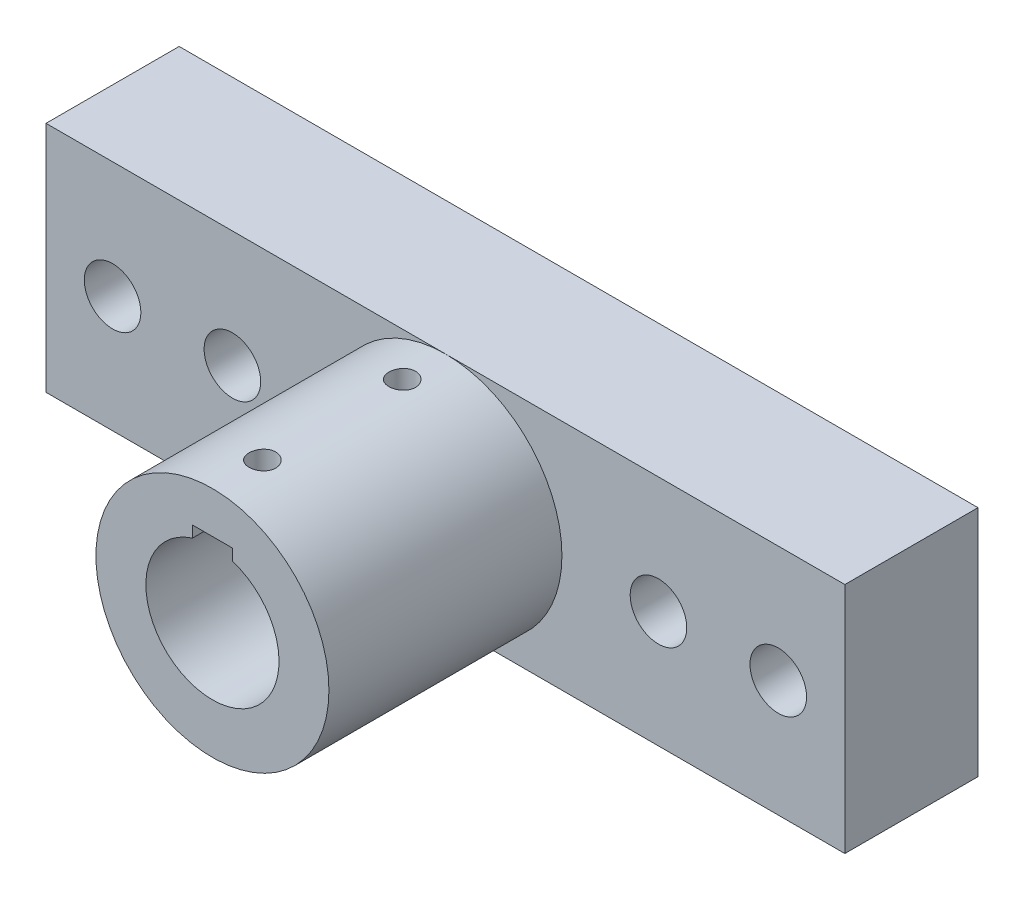
ISO-10303-21;
HEADER;
FILE_DESCRIPTION(('STEP AP214'),'2;1');
FILE_NAME('part.step','',(''),(''),'','','');
FILE_SCHEMA(('AUTOMOTIVE_DESIGN { 1 0 10303 214 1 1 1 1 }'));
ENDSEC;
DATA;
#1=APPLICATION_CONTEXT('core data for automotive mechanical design processes');
#2=APPLICATION_PROTOCOL_DEFINITION('international standard','automotive_design',2000,#1);
#3=PRODUCT_CONTEXT('',#1,'mechanical');
#4=PRODUCT('Part','Part','',(#3));
#5=PRODUCT_RELATED_PRODUCT_CATEGORY('part','',(#4));
#6=PRODUCT_DEFINITION_FORMATION('','',#4);
#7=PRODUCT_DEFINITION_CONTEXT('part definition',#1,'design');
#8=PRODUCT_DEFINITION('design','',#6,#7);
#9=PRODUCT_DEFINITION_SHAPE('','',#8);
#10=(LENGTH_UNIT() NAMED_UNIT(*) SI_UNIT(.MILLI.,.METRE.));
#11=(NAMED_UNIT(*) PLANE_ANGLE_UNIT() SI_UNIT($,.RADIAN.));
#12=(NAMED_UNIT(*) SI_UNIT($,.STERADIAN.) SOLID_ANGLE_UNIT());
#13=UNCERTAINTY_MEASURE_WITH_UNIT(LENGTH_MEASURE(1.E-05),#10,'distance_accuracy_value','');
#14=(GEOMETRIC_REPRESENTATION_CONTEXT(3) GLOBAL_UNCERTAINTY_ASSIGNED_CONTEXT((#13)) GLOBAL_UNIT_ASSIGNED_CONTEXT((#10,
#11,#12)) REPRESENTATION_CONTEXT('',''));
#15=CARTESIAN_POINT('',(0.,0.,0.));
#16=DIRECTION('',(0.,0.,1.));
#17=DIRECTION('',(1.,0.,0.));
#18=AXIS2_PLACEMENT_3D('',#15,#16,#17);
#19=CARTESIAN_POINT('',(17.5,35.,40.));
#20=DIRECTION('',(0.,0.,-1.));
#21=DIRECTION('',(-1.,0.,0.));
#22=AXIS2_PLACEMENT_3D('',#19,#20,#21);
#23=PLANE('',#22);
#24=CARTESIAN_POINT('',(0.,17.5,40.));
#25=DIRECTION('',(0.,0.,1.));
#26=DIRECTION('',(1.,0.,0.));
#27=AXIS2_PLACEMENT_3D('',#24,#25,#26);
#28=CIRCLE('',#27,10.);
#29=CARTESIAN_POINT('',(-3.,27.0393920141695,40.));
#30=VERTEX_POINT('',#29);
#31=CARTESIAN_POINT('',(3.,27.0393920141695,40.));
#32=VERTEX_POINT('',#31);
#33=EDGE_CURVE('E250',#30,#32,#28,.T.);
#34=ORIENTED_EDGE('',*,*,#33,.F.);
#35=DIRECTION('',(0.,-1.,0.));
#36=VECTOR('',#35,1.);
#37=CARTESIAN_POINT('',(-3.,0.,40.));
#38=LINE('',#37,#36);
#39=CARTESIAN_POINT('',(-3.,28.75,40.));
#40=VERTEX_POINT('',#39);
#41=EDGE_CURVE('E98',#40,#30,#38,.T.);
#42=ORIENTED_EDGE('',*,*,#41,.F.);
#43=DIRECTION('',(1.,0.,0.));
#44=VECTOR('',#43,1.);
#45=CARTESIAN_POINT('',(0.,28.75,40.));
#46=LINE('',#45,#44);
#47=CARTESIAN_POINT('',(3.,28.75,40.));
#48=VERTEX_POINT('',#47);
#49=EDGE_CURVE('E237',#40,#48,#46,.T.);
#50=ORIENTED_EDGE('',*,*,#49,.T.);
#51=DIRECTION('',(0.,-1.,0.));
#52=VECTOR('',#51,1.);
#53=CARTESIAN_POINT('',(3.,0.,40.));
#54=LINE('',#53,#52);
#55=EDGE_CURVE('E253',#48,#32,#54,.T.);
#56=ORIENTED_EDGE('',*,*,#55,.T.);
#57=EDGE_LOOP('',(#34,#42,#50,#56));
#58=FACE_BOUND('',#57,.T.);
#59=CARTESIAN_POINT('',(0.,17.5,40.));
#60=DIRECTION('',(0.,0.,1.));
#61=DIRECTION('',(1.,0.,0.));
#62=AXIS2_PLACEMENT_3D('',#59,#60,#61);
#63=CIRCLE('',#62,17.5);
#64=CARTESIAN_POINT('',(17.5,17.5,40.));
#65=VERTEX_POINT('',#64);
#66=EDGE_CURVE('E175',#65,#65,#63,.T.);
#67=ORIENTED_EDGE('',*,*,#66,.T.);
#68=EDGE_LOOP('',(#67));
#69=FACE_BOUND('',#68,.T.);
#70=ADVANCED_FACE('F82',(#58,#69),#23,.F.);
#71=CARTESIAN_POINT('',(-60.,35.,5.00000000000001));
#72=DIRECTION('',(1.,0.,0.));
#73=DIRECTION('',(0.,0.,-1.));
#74=AXIS2_PLACEMENT_3D('',#71,#72,#73);
#75=PLANE('',#74);
#76=DIRECTION('',(0.,0.,1.));
#77=VECTOR('',#76,1.);
#78=CARTESIAN_POINT('',(-60.,0.,5.00000000000001));
#79=LINE('',#78,#77);
#80=CARTESIAN_POINT('',(-60.,0.,-15.));
#81=VERTEX_POINT('',#80);
#82=CARTESIAN_POINT('',(-60.,0.,5.00000000000001));
#83=VERTEX_POINT('',#82);
#84=EDGE_CURVE('E165',#81,#83,#79,.T.);
#85=ORIENTED_EDGE('',*,*,#84,.T.);
#86=DIRECTION('',(0.,-1.,0.));
#87=VECTOR('',#86,1.);
#88=CARTESIAN_POINT('',(-60.,35.,5.00000000000001));
#89=LINE('',#88,#87);
#90=CARTESIAN_POINT('',(-60.,35.,5.00000000000001));
#91=VERTEX_POINT('',#90);
#92=EDGE_CURVE('E12',#91,#83,#89,.T.);
#93=ORIENTED_EDGE('',*,*,#92,.F.);
#94=DIRECTION('',(0.,0.,1.));
#95=VECTOR('',#94,1.);
#96=CARTESIAN_POINT('',(-60.,35.,5.00000000000001));
#97=LINE('',#96,#95);
#98=CARTESIAN_POINT('',(-60.,35.,-15.));
#99=VERTEX_POINT('',#98);
#100=EDGE_CURVE('E270',#99,#91,#97,.T.);
#101=ORIENTED_EDGE('',*,*,#100,.F.);
#102=DIRECTION('',(0.,-1.,0.));
#103=VECTOR('',#102,1.);
#104=CARTESIAN_POINT('',(-60.,35.,-15.));
#105=LINE('',#104,#103);
#106=EDGE_CURVE('E286',#99,#81,#105,.T.);
#107=ORIENTED_EDGE('',*,*,#106,.T.);
#108=EDGE_LOOP('',(#85,#93,#101,#107));
#109=FACE_BOUND('',#108,.T.);
#110=ADVANCED_FACE('F84',(#109),#75,.F.);
#111=CARTESIAN_POINT('',(-17.5,35.,5.));
#112=DIRECTION('',(0.,0.,-1.));
#113=DIRECTION('',(-1.,0.,0.));
#114=AXIS2_PLACEMENT_3D('',#111,#112,#113);
#115=PLANE('',#114);
#116=CARTESIAN_POINT('',(-50.,17.5,5.));
#117=DIRECTION('',(0.,0.,1.));
#118=DIRECTION('',(1.,0.,0.));
#119=AXIS2_PLACEMENT_3D('',#116,#117,#118);
#120=CIRCLE('',#119,4.25);
#121=CARTESIAN_POINT('',(-45.75,17.5,5.));
#122=VERTEX_POINT('',#121);
#123=EDGE_CURVE('E205',#122,#122,#120,.T.);
#124=ORIENTED_EDGE('',*,*,#123,.F.);
#125=EDGE_LOOP('',(#124));
#126=FACE_BOUND('',#125,.T.);
#127=CARTESIAN_POINT('',(-32.,17.5,5.));
#128=DIRECTION('',(0.,0.,1.));
#129=DIRECTION('',(1.,0.,0.));
#130=AXIS2_PLACEMENT_3D('',#127,#128,#129);
#131=CIRCLE('',#130,4.25);
#132=CARTESIAN_POINT('',(-27.75,17.5,5.));
#133=VERTEX_POINT('',#132);
#134=EDGE_CURVE('E209',#133,#133,#131,.T.);
#135=ORIENTED_EDGE('',*,*,#134,.F.);
#136=EDGE_LOOP('',(#135));
#137=FACE_BOUND('',#136,.T.);
#138=DIRECTION('',(1.,0.,0.));
#139=VECTOR('',#138,1.);
#140=CARTESIAN_POINT('',(-17.5,0.,5.));
#141=LINE('',#140,#139);
#142=CARTESIAN_POINT('',(0.,0.,5.));
#143=VERTEX_POINT('',#142);
#144=EDGE_CURVE('E154',#83,#143,#141,.T.);
#145=ORIENTED_EDGE('',*,*,#144,.T.);
#146=CARTESIAN_POINT('',(0.,17.5,5.));
#147=DIRECTION('',(0.,0.,-1.));
#148=DIRECTION('',(-1.,0.,0.));
#149=AXIS2_PLACEMENT_3D('',#146,#147,#148);
#150=CIRCLE('',#149,17.5);
#151=CARTESIAN_POINT('',(0.,35.,5.));
#152=VERTEX_POINT('',#151);
#153=EDGE_CURVE('E157',#152,#143,#150,.F.);
#154=ORIENTED_EDGE('',*,*,#153,.F.);
#155=DIRECTION('',(1.,0.,0.));
#156=VECTOR('',#155,1.);
#157=CARTESIAN_POINT('',(-17.5,35.,5.));
#158=LINE('',#157,#156);
#159=EDGE_CURVE('E274',#91,#152,#158,.T.);
#160=ORIENTED_EDGE('',*,*,#159,.F.);
#161=ORIENTED_EDGE('',*,*,#92,.T.);
#162=EDGE_LOOP('',(#145,#154,#160,#161));
#163=FACE_BOUND('',#162,.T.);
#164=ADVANCED_FACE('F156',(#126,#137,#163),#115,.F.);
#165=CARTESIAN_POINT('',(60.,35.,5.00000000000001));
#166=DIRECTION('',(0.,0.,-1.));
#167=DIRECTION('',(-1.,0.,0.));
#168=AXIS2_PLACEMENT_3D('',#165,#166,#167);
#169=PLANE('',#168);
#170=CARTESIAN_POINT('',(32.,17.5,5.));
#171=DIRECTION('',(0.,0.,1.));
#172=DIRECTION('',(-1.,0.,0.));
#173=AXIS2_PLACEMENT_3D('',#170,#171,#172);
#174=CIRCLE('',#173,4.25);
#175=CARTESIAN_POINT('',(27.75,17.5,5.));
#176=VERTEX_POINT('',#175);
#177=EDGE_CURVE('E217',#176,#176,#174,.T.);
#178=ORIENTED_EDGE('',*,*,#177,.F.);
#179=EDGE_LOOP('',(#178));
#180=FACE_BOUND('',#179,.T.);
#181=CARTESIAN_POINT('',(50.,17.5,5.));
#182=DIRECTION('',(0.,0.,1.));
#183=DIRECTION('',(-1.,0.,0.));
#184=AXIS2_PLACEMENT_3D('',#181,#182,#183);
#185=CIRCLE('',#184,4.25);
#186=CARTESIAN_POINT('',(45.75,17.5,5.));
#187=VERTEX_POINT('',#186);
#188=EDGE_CURVE('E225',#187,#187,#185,.T.);
#189=ORIENTED_EDGE('',*,*,#188,.F.);
#190=EDGE_LOOP('',(#189));
#191=FACE_BOUND('',#190,.T.);
#192=DIRECTION('',(1.,0.,0.));
#193=VECTOR('',#192,1.);
#194=CARTESIAN_POINT('',(60.,0.,5.00000000000001));
#195=LINE('',#194,#193);
#196=CARTESIAN_POINT('',(60.,0.,5.00000000000001));
#197=VERTEX_POINT('',#196);
#198=EDGE_CURVE('E164',#143,#197,#195,.T.);
#199=ORIENTED_EDGE('',*,*,#198,.T.);
#200=DIRECTION('',(0.,-1.,0.));
#201=VECTOR('',#200,1.);
#202=CARTESIAN_POINT('',(60.,35.,5.00000000000001));
#203=LINE('',#202,#201);
#204=CARTESIAN_POINT('',(60.,35.,5.00000000000001));
#205=VERTEX_POINT('',#204);
#206=EDGE_CURVE('E91',#205,#197,#203,.T.);
#207=ORIENTED_EDGE('',*,*,#206,.F.);
#208=DIRECTION('',(1.,0.,0.));
#209=VECTOR('',#208,1.);
#210=CARTESIAN_POINT('',(60.,35.,5.00000000000001));
#211=LINE('',#210,#209);
#212=EDGE_CURVE('E187',#152,#205,#211,.T.);
#213=ORIENTED_EDGE('',*,*,#212,.F.);
#214=CARTESIAN_POINT('',(0.,17.5,5.));
#215=DIRECTION('',(0.,0.,-1.));
#216=DIRECTION('',(-1.,0.,0.));
#217=AXIS2_PLACEMENT_3D('',#214,#215,#216);
#218=CIRCLE('',#217,17.5);
#219=EDGE_CURVE('E171',#143,#152,#218,.F.);
#220=ORIENTED_EDGE('',*,*,#219,.F.);
#221=EDGE_LOOP('',(#199,#207,#213,#220));
#222=FACE_BOUND('',#221,.T.);
#223=ADVANCED_FACE('F186',(#180,#191,#222),#169,.F.);
#224=CARTESIAN_POINT('',(60.,35.,-15.));
#225=DIRECTION('',(-1.,0.,0.));
#226=DIRECTION('',(0.,0.,1.));
#227=AXIS2_PLACEMENT_3D('',#224,#225,#226);
#228=PLANE('',#227);
#229=DIRECTION('',(0.,0.,-1.));
#230=VECTOR('',#229,1.);
#231=CARTESIAN_POINT('',(60.,0.,-15.));
#232=LINE('',#231,#230);
#233=CARTESIAN_POINT('',(60.,0.,-15.));
#234=VERTEX_POINT('',#233);
#235=EDGE_CURVE('E180',#197,#234,#232,.T.);
#236=ORIENTED_EDGE('',*,*,#235,.T.);
#237=DIRECTION('',(0.,-1.,0.));
#238=VECTOR('',#237,1.);
#239=CARTESIAN_POINT('',(60.,35.,-15.));
#240=LINE('',#239,#238);
#241=CARTESIAN_POINT('',(60.,35.,-15.));
#242=VERTEX_POINT('',#241);
#243=EDGE_CURVE('E296',#242,#234,#240,.T.);
#244=ORIENTED_EDGE('',*,*,#243,.F.);
#245=DIRECTION('',(0.,0.,-1.));
#246=VECTOR('',#245,1.);
#247=CARTESIAN_POINT('',(60.,35.,-15.));
#248=LINE('',#247,#246);
#249=EDGE_CURVE('E280',#205,#242,#248,.T.);
#250=ORIENTED_EDGE('',*,*,#249,.F.);
#251=ORIENTED_EDGE('',*,*,#206,.T.);
#252=EDGE_LOOP('',(#236,#244,#250,#251));
#253=FACE_BOUND('',#252,.T.);
#254=ADVANCED_FACE('F303',(#253),#228,.F.);
#255=CARTESIAN_POINT('',(-60.,35.,-15.));
#256=DIRECTION('',(0.,0.,1.));
#257=DIRECTION('',(1.,0.,0.));
#258=AXIS2_PLACEMENT_3D('',#255,#256,#257);
#259=PLANE('',#258);
#260=CARTESIAN_POINT('',(-50.,17.5,-15.));
#261=DIRECTION('',(0.,0.,1.));
#262=DIRECTION('',(1.,0.,0.));
#263=AXIS2_PLACEMENT_3D('',#260,#261,#262);
#264=CIRCLE('',#263,4.25);
#265=CARTESIAN_POINT('',(-45.75,17.5,-15.));
#266=VERTEX_POINT('',#265);
#267=EDGE_CURVE('E201',#266,#266,#264,.T.);
#268=ORIENTED_EDGE('',*,*,#267,.T.);
#269=EDGE_LOOP('',(#268));
#270=FACE_BOUND('',#269,.T.);
#271=CARTESIAN_POINT('',(-32.,17.5,-15.));
#272=DIRECTION('',(0.,0.,1.));
#273=DIRECTION('',(1.,0.,0.));
#274=AXIS2_PLACEMENT_3D('',#271,#272,#273);
#275=CIRCLE('',#274,4.25);
#276=CARTESIAN_POINT('',(-27.75,17.5,-15.));
#277=VERTEX_POINT('',#276);
#278=EDGE_CURVE('E213',#277,#277,#275,.T.);
#279=ORIENTED_EDGE('',*,*,#278,.T.);
#280=EDGE_LOOP('',(#279));
#281=FACE_BOUND('',#280,.T.);
#282=CARTESIAN_POINT('',(32.,17.5,-15.));
#283=DIRECTION('',(0.,0.,1.));
#284=DIRECTION('',(-1.,0.,0.));
#285=AXIS2_PLACEMENT_3D('',#282,#283,#284);
#286=CIRCLE('',#285,4.25);
#287=CARTESIAN_POINT('',(27.75,17.5,-15.));
#288=VERTEX_POINT('',#287);
#289=EDGE_CURVE('E221',#288,#288,#286,.T.);
#290=ORIENTED_EDGE('',*,*,#289,.T.);
#291=EDGE_LOOP('',(#290));
#292=FACE_BOUND('',#291,.T.);
#293=CARTESIAN_POINT('',(50.,17.5,-15.));
#294=DIRECTION('',(0.,0.,1.));
#295=DIRECTION('',(-1.,0.,0.));
#296=AXIS2_PLACEMENT_3D('',#293,#294,#295);
#297=CIRCLE('',#296,4.25);
#298=CARTESIAN_POINT('',(45.75,17.5,-15.));
#299=VERTEX_POINT('',#298);
#300=EDGE_CURVE('E174',#299,#299,#297,.T.);
#301=ORIENTED_EDGE('',*,*,#300,.T.);
#302=EDGE_LOOP('',(#301));
#303=FACE_BOUND('',#302,.T.);
#304=DIRECTION('',(1.,0.,0.));
#305=VECTOR('',#304,1.);
#306=CARTESIAN_POINT('',(0.,28.75,-15.));
#307=LINE('',#306,#305);
#308=CARTESIAN_POINT('',(-3.,28.75,-15.));
#309=VERTEX_POINT('',#308);
#310=CARTESIAN_POINT('',(3.,28.75,-15.));
#311=VERTEX_POINT('',#310);
#312=EDGE_CURVE('E244',#309,#311,#307,.T.);
#313=ORIENTED_EDGE('',*,*,#312,.F.);
#314=DIRECTION('',(0.,-1.,0.));
#315=VECTOR('',#314,1.);
#316=CARTESIAN_POINT('',(-3.,0.,-15.));
#317=LINE('',#316,#315);
#318=CARTESIAN_POINT('',(-3.,27.0393920141695,-15.));
#319=VERTEX_POINT('',#318);
#320=EDGE_CURVE('E232',#309,#319,#317,.T.);
#321=ORIENTED_EDGE('',*,*,#320,.T.);
#322=CARTESIAN_POINT('',(0.,17.5,-15.));
#323=DIRECTION('',(0.,0.,1.));
#324=DIRECTION('',(1.,0.,0.));
#325=AXIS2_PLACEMENT_3D('',#322,#323,#324);
#326=CIRCLE('',#325,10.);
#327=CARTESIAN_POINT('',(3.,27.0393920141695,-15.));
#328=VERTEX_POINT('',#327);
#329=EDGE_CURVE('E236',#319,#328,#326,.T.);
#330=ORIENTED_EDGE('',*,*,#329,.T.);
#331=DIRECTION('',(0.,-1.,0.));
#332=VECTOR('',#331,1.);
#333=CARTESIAN_POINT('',(3.,0.,-15.));
#334=LINE('',#333,#332);
#335=EDGE_CURVE('E241',#311,#328,#334,.T.);
#336=ORIENTED_EDGE('',*,*,#335,.F.);
#337=EDGE_LOOP('',(#313,#321,#330,#336));
#338=FACE_BOUND('',#337,.T.);
#339=DIRECTION('',(-1.,0.,0.));
#340=VECTOR('',#339,1.);
#341=CARTESIAN_POINT('',(-60.,0.,-15.));
#342=LINE('',#341,#340);
#343=EDGE_CURVE('E275',#234,#81,#342,.T.);
#344=ORIENTED_EDGE('',*,*,#343,.T.);
#345=ORIENTED_EDGE('',*,*,#106,.F.);
#346=DIRECTION('',(-1.,0.,0.));
#347=VECTOR('',#346,1.);
#348=CARTESIAN_POINT('',(-60.,35.,-15.));
#349=LINE('',#348,#347);
#350=EDGE_CURVE('E283',#242,#99,#349,.T.);
#351=ORIENTED_EDGE('',*,*,#350,.F.);
#352=ORIENTED_EDGE('',*,*,#243,.T.);
#353=EDGE_LOOP('',(#344,#345,#351,#352));
#354=FACE_BOUND('',#353,.T.);
#355=ADVANCED_FACE('F312',(#270,#281,#292,#303,#338,#354),#259,.F.);
#356=CARTESIAN_POINT('',(0.,35.,0.));
#357=DIRECTION('',(0.,-1.,0.));
#358=DIRECTION('',(0.,0.,-1.));
#359=AXIS2_PLACEMENT_3D('',#356,#357,#358);
#360=PLANE('',#359);
#361=ORIENTED_EDGE('',*,*,#159,.T.);
#362=ORIENTED_EDGE('',*,*,#212,.T.);
#363=ORIENTED_EDGE('',*,*,#249,.T.);
#364=ORIENTED_EDGE('',*,*,#350,.T.);
#365=ORIENTED_EDGE('',*,*,#100,.T.);
#366=EDGE_LOOP('',(#361,#362,#363,#364,#365));
#367=FACE_BOUND('',#366,.T.);
#368=ADVANCED_FACE('F307',(#367),#360,.F.);
#369=CARTESIAN_POINT('',(0.,0.,0.));
#370=DIRECTION('',(0.,-1.,0.));
#371=DIRECTION('',(0.,0.,-1.));
#372=AXIS2_PLACEMENT_3D('',#369,#370,#371);
#373=PLANE('',#372);
#374=ORIENTED_EDGE('',*,*,#198,.F.);
#375=ORIENTED_EDGE('',*,*,#144,.F.);
#376=ORIENTED_EDGE('',*,*,#84,.F.);
#377=ORIENTED_EDGE('',*,*,#343,.F.);
#378=ORIENTED_EDGE('',*,*,#235,.F.);
#379=EDGE_LOOP('',(#374,#375,#376,#377,#378));
#380=FACE_BOUND('',#379,.T.);
#381=ADVANCED_FACE('F178',(#380),#373,.T.);
#382=CARTESIAN_POINT('',(-3.,0.,-15.));
#383=DIRECTION('',(-1.,0.,0.));
#384=DIRECTION('',(0.,0.,1.));
#385=AXIS2_PLACEMENT_3D('',#382,#383,#384);
#386=PLANE('',#385);
#387=ORIENTED_EDGE('',*,*,#41,.T.);
#388=DIRECTION('',(0.,0.,1.));
#389=VECTOR('',#388,1.);
#390=CARTESIAN_POINT('',(-3.,27.0393920141695,-15.));
#391=LINE('',#390,#389);
#392=EDGE_CURVE('E247',#319,#30,#391,.T.);
#393=ORIENTED_EDGE('',*,*,#392,.F.);
#394=ORIENTED_EDGE('',*,*,#320,.F.);
#395=DIRECTION('',(0.,0.,1.));
#396=VECTOR('',#395,1.);
#397=CARTESIAN_POINT('',(-3.,28.75,-15.));
#398=LINE('',#397,#396);
#399=EDGE_CURVE('E260',#309,#40,#398,.T.);
#400=ORIENTED_EDGE('',*,*,#399,.T.);
#401=EDGE_LOOP('',(#387,#393,#394,#400));
#402=FACE_BOUND('',#401,.T.);
#403=ADVANCED_FACE('F369',(#402),#386,.F.);
#404=CARTESIAN_POINT('',(0.,28.75,-15.));
#405=DIRECTION('',(0.,-1.,0.));
#406=DIRECTION('',(0.,0.,-1.));
#407=AXIS2_PLACEMENT_3D('',#404,#405,#406);
#408=PLANE('',#407);
#409=CARTESIAN_POINT('',(0.,28.75,32.5));
#410=DIRECTION('',(0.,-1.,0.));
#411=DIRECTION('',(0.,0.,-1.));
#412=AXIS2_PLACEMENT_3D('',#409,#410,#411);
#413=CIRCLE('',#412,2.);
#414=CARTESIAN_POINT('',(0.,28.75,30.5));
#415=VERTEX_POINT('',#414);
#416=EDGE_CURVE('E197',#415,#415,#413,.F.);
#417=ORIENTED_EDGE('',*,*,#416,.T.);
#418=EDGE_LOOP('',(#417));
#419=FACE_BOUND('',#418,.T.);
#420=CARTESIAN_POINT('',(0.,28.75,11.5));
#421=DIRECTION('',(0.,-1.,0.));
#422=DIRECTION('',(0.,0.,-1.));
#423=AXIS2_PLACEMENT_3D('',#420,#421,#422);
#424=CIRCLE('',#423,2.);
#425=CARTESIAN_POINT('',(0.,28.75,9.50000000000001));
#426=VERTEX_POINT('',#425);
#427=EDGE_CURVE('E583',#426,#426,#424,.F.);
#428=ORIENTED_EDGE('',*,*,#427,.T.);
#429=EDGE_LOOP('',(#428));
#430=FACE_BOUND('',#429,.T.);
#431=ORIENTED_EDGE('',*,*,#49,.F.);
#432=ORIENTED_EDGE('',*,*,#399,.F.);
#433=ORIENTED_EDGE('',*,*,#312,.T.);
#434=DIRECTION('',(0.,0.,1.));
#435=VECTOR('',#434,1.);
#436=CARTESIAN_POINT('',(3.,28.75,-15.));
#437=LINE('',#436,#435);
#438=EDGE_CURVE('E263',#311,#48,#437,.T.);
#439=ORIENTED_EDGE('',*,*,#438,.T.);
#440=EDGE_LOOP('',(#431,#432,#433,#439));
#441=FACE_BOUND('',#440,.T.);
#442=ADVANCED_FACE('F365',(#419,#430,#441),#408,.T.);
#443=CARTESIAN_POINT('',(3.,0.,-15.));
#444=DIRECTION('',(-1.,0.,0.));
#445=DIRECTION('',(0.,0.,1.));
#446=AXIS2_PLACEMENT_3D('',#443,#444,#445);
#447=PLANE('',#446);
#448=ORIENTED_EDGE('',*,*,#55,.F.);
#449=ORIENTED_EDGE('',*,*,#438,.F.);
#450=ORIENTED_EDGE('',*,*,#335,.T.);
#451=DIRECTION('',(0.,0.,1.));
#452=VECTOR('',#451,1.);
#453=CARTESIAN_POINT('',(3.,27.0393920141695,-15.));
#454=LINE('',#453,#452);
#455=EDGE_CURVE('E106',#328,#32,#454,.T.);
#456=ORIENTED_EDGE('',*,*,#455,.T.);
#457=EDGE_LOOP('',(#448,#449,#450,#456));
#458=FACE_BOUND('',#457,.T.);
#459=ADVANCED_FACE('F368',(#458),#447,.T.);
#460=CARTESIAN_POINT('',(0.,17.5,-15.));
#461=DIRECTION('',(0.,0.,1.));
#462=DIRECTION('',(1.,0.,0.));
#463=AXIS2_PLACEMENT_3D('',#460,#461,#462);
#464=CYLINDRICAL_SURFACE('',#463,10.);
#465=ORIENTED_EDGE('',*,*,#33,.T.);
#466=ORIENTED_EDGE('',*,*,#455,.F.);
#467=ORIENTED_EDGE('',*,*,#329,.F.);
#468=ORIENTED_EDGE('',*,*,#392,.T.);
#469=EDGE_LOOP('',(#465,#466,#467,#468));
#470=FACE_BOUND('',#469,.T.);
#471=ADVANCED_FACE('F363',(#470),#464,.F.);
#472=CARTESIAN_POINT('',(50.,17.5,-15.));
#473=DIRECTION('',(0.,0.,1.));
#474=DIRECTION('',(1.,0.,0.));
#475=AXIS2_PLACEMENT_3D('',#472,#473,#474);
#476=CYLINDRICAL_SURFACE('',#475,4.25);
#477=ORIENTED_EDGE('',*,*,#300,.F.);
#478=EDGE_LOOP('',(#477));
#479=FACE_BOUND('',#478,.T.);
#480=ORIENTED_EDGE('',*,*,#188,.T.);
#481=EDGE_LOOP('',(#480));
#482=FACE_BOUND('',#481,.T.);
#483=ADVANCED_FACE('F355',(#479,#482),#476,.F.);
#484=CARTESIAN_POINT('',(32.,17.5,-15.));
#485=DIRECTION('',(0.,0.,1.));
#486=DIRECTION('',(1.,0.,0.));
#487=AXIS2_PLACEMENT_3D('',#484,#485,#486);
#488=CYLINDRICAL_SURFACE('',#487,4.25);
#489=ORIENTED_EDGE('',*,*,#289,.F.);
#490=EDGE_LOOP('',(#489));
#491=FACE_BOUND('',#490,.T.);
#492=ORIENTED_EDGE('',*,*,#177,.T.);
#493=EDGE_LOOP('',(#492));
#494=FACE_BOUND('',#493,.T.);
#495=ADVANCED_FACE('F346',(#491,#494),#488,.F.);
#496=CARTESIAN_POINT('',(-32.,17.5,-15.));
#497=DIRECTION('',(0.,0.,1.));
#498=DIRECTION('',(1.,0.,0.));
#499=AXIS2_PLACEMENT_3D('',#496,#497,#498);
#500=CYLINDRICAL_SURFACE('',#499,4.25);
#501=ORIENTED_EDGE('',*,*,#278,.F.);
#502=EDGE_LOOP('',(#501));
#503=FACE_BOUND('',#502,.T.);
#504=ORIENTED_EDGE('',*,*,#134,.T.);
#505=EDGE_LOOP('',(#504));
#506=FACE_BOUND('',#505,.T.);
#507=ADVANCED_FACE('F343',(#503,#506),#500,.F.);
#508=CARTESIAN_POINT('',(-50.,17.5,-15.));
#509=DIRECTION('',(0.,0.,1.));
#510=DIRECTION('',(1.,0.,0.));
#511=AXIS2_PLACEMENT_3D('',#508,#509,#510);
#512=CYLINDRICAL_SURFACE('',#511,4.25);
#513=ORIENTED_EDGE('',*,*,#267,.F.);
#514=EDGE_LOOP('',(#513));
#515=FACE_BOUND('',#514,.T.);
#516=ORIENTED_EDGE('',*,*,#123,.T.);
#517=EDGE_LOOP('',(#516));
#518=FACE_BOUND('',#517,.T.);
#519=ADVANCED_FACE('F345',(#515,#518),#512,.F.);
#520=CARTESIAN_POINT('',(0.,17.5,-19.7487373415292));
#521=DIRECTION('',(0.,0.,1.));
#522=DIRECTION('',(1.,0.,0.));
#523=AXIS2_PLACEMENT_3D('',#520,#521,#522);
#524=CYLINDRICAL_SURFACE('',#523,17.5);
#525=CARTESIAN_POINT('',(0.,35.,34.5));
#526=CARTESIAN_POINT('',(-0.111949281131272,34.9999985510682,34.4999951997222));
#527=CARTESIAN_POINT('',(-0.223970370284169,34.9989143966958,34.4905688469133));
#528=CARTESIAN_POINT('',(-0.444900622583235,34.9946937577693,34.4531111143345));
#529=CARTESIAN_POINT('',(-0.553806324423905,34.9915550764498,34.4250598197261));
#530=CARTESIAN_POINT('',(-0.76527499571213,34.9835792974507,34.3511849395428));
#531=CARTESIAN_POINT('',(-0.867841986694448,34.9787432899077,34.3053727592277));
#532=CARTESIAN_POINT('',(-1.06381060236177,34.9679120331755,34.1973002592898));
#533=CARTESIAN_POINT('',(-1.15721390847254,34.9619169972561,34.1350429649174));
#534=CARTESIAN_POINT('',(-1.33265783514777,34.9494069384049,33.9955382762926));
#535=CARTESIAN_POINT('',(-1.41464987662083,34.9428898679339,33.9182299656205));
#536=CARTESIAN_POINT('',(-1.5645257957997,34.9300869526196,33.7509482436648));
#537=CARTESIAN_POINT('',(-1.63240898570475,34.9238011190613,33.6609742152912));
#538=CARTESIAN_POINT('',(-1.75231750467918,34.9121519566138,33.470604232541));
#539=CARTESIAN_POINT('',(-1.80429797266076,34.9067912557056,33.370179846836));
#540=CARTESIAN_POINT('',(-1.89063905410776,34.8976257108765,33.1619560375685));
#541=CARTESIAN_POINT('',(-1.9250002289204,34.8938208173886,33.0541568490897));
#542=CARTESIAN_POINT('',(-1.97498120601606,34.8882168566912,32.8347441867955));
#543=CARTESIAN_POINT('',(-1.99068245631194,34.8864090748178,32.7231494927737));
#544=CARTESIAN_POINT('',(-2.00314979639016,34.8849772070577,32.498895406583));
#545=CARTESIAN_POINT('',(-1.99991652712141,34.8853530472536,32.3862360505826));
#546=CARTESIAN_POINT('',(-1.9746735877826,34.8882379876878,32.1636154230489));
#547=CARTESIAN_POINT('',(-1.95275327430007,34.8907369355841,32.0536438692079));
#548=CARTESIAN_POINT('',(-1.89089772862114,34.8975706833084,31.8389506189016));
#549=CARTESIAN_POINT('',(-1.85096218648166,34.9019055147219,31.7342290127935));
#550=CARTESIAN_POINT('',(-1.7541125869063,34.9119342022004,31.5327285909367));
#551=CARTESIAN_POINT('',(-1.697159329054,34.9176311898807,31.4359687787687));
#552=CARTESIAN_POINT('',(-1.5679190891396,34.9297397716759,31.2533467072563));
#553=CARTESIAN_POINT('',(-1.49563152051157,34.9361513931222,31.1674848649804));
#554=CARTESIAN_POINT('',(-1.33727766100704,34.9490120091816,31.0085771083073));
#555=CARTESIAN_POINT('',(-1.25113428048549,34.955461005996,30.9356079930233));
#556=CARTESIAN_POINT('',(-1.06778054344645,34.9676349914203,30.8051537463782));
#557=CARTESIAN_POINT('',(-0.970570168013122,34.9733599787928,30.7476686414831));
#558=CARTESIAN_POINT('',(-0.767785399909198,34.9834436495983,30.6498155820125));
#559=CARTESIAN_POINT('',(-0.662208868897604,34.9878019823021,30.6094520204612));
#560=CARTESIAN_POINT('',(-0.445716005555921,34.9946579437091,30.5470466496761));
#561=CARTESIAN_POINT('',(-0.334799882177866,34.9971556451608,30.5250041241085));
#562=CARTESIAN_POINT('',(-0.11144084718914,34.9999995196358,30.4999651080582));
#563=CARTESIAN_POINT('',(0.000990049263887338,35.0003576527763,30.4968627405709));
#564=CARTESIAN_POINT('',(0.224770143214531,34.9989142301576,30.5095132992264));
#565=CARTESIAN_POINT('',(0.336119359859266,34.9971127126976,30.5252658909967));
#566=CARTESIAN_POINT('',(0.554265994438545,34.9915599395696,30.5750913035956));
#567=CARTESIAN_POINT('',(0.6610749957154,34.9878140135584,30.609114054366));
#568=CARTESIAN_POINT('',(0.867470606546543,34.9787921749894,30.6944622223766));
#569=CARTESIAN_POINT('',(0.967057008006428,34.9735162183709,30.7457881379076));
#570=CARTESIAN_POINT('',(1.1566560556988,34.9619935546906,30.8645447606647));
#571=CARTESIAN_POINT('',(1.24662524248109,34.9557427309721,30.9320444463113));
#572=CARTESIAN_POINT('',(1.41399482686995,34.9429836190554,31.0811343594058));
#573=CARTESIAN_POINT('',(1.49139480973755,34.9364753223705,31.1627250516236));
#574=CARTESIAN_POINT('',(1.63180089287334,34.9238982965486,31.3381453244017));
#575=CARTESIAN_POINT('',(1.69473712215656,34.9178317940395,31.4320310121307));
#576=CARTESIAN_POINT('',(1.80394755942105,34.9068606742743,31.6291019220503));
#577=CARTESIAN_POINT('',(1.85022205420213,34.9019560370195,31.7322869841319));
#578=CARTESIAN_POINT('',(1.92468057699606,34.8938786287494,31.9447957127648));
#579=CARTESIAN_POINT('',(1.9529049884149,34.8907019940762,32.0541050767896));
#580=CARTESIAN_POINT('',(1.99059267414119,34.8864287991637,32.2759500109253));
#581=CARTESIAN_POINT('',(2.00005666745658,34.885332159207,32.3884854572264));
#582=CARTESIAN_POINT('',(1.99994314687055,34.885345163739,32.6128933076389));
#583=CARTESIAN_POINT('',(1.99047539100516,34.8864420908835,32.7247657840231));
#584=CARTESIAN_POINT('',(1.95299850876729,34.8906913968281,32.9453189880881));
#585=CARTESIAN_POINT('',(1.92498937098975,34.8938437768924,33.0539997138055));
#586=CARTESIAN_POINT('',(1.85125733006852,34.9018450488478,33.2650760433623));
#587=CARTESIAN_POINT('',(1.80553879088569,34.9066935227579,33.3674731884096));
#588=CARTESIAN_POINT('',(1.69769666392679,34.9175414489812,33.5631591816063));
#589=CARTESIAN_POINT('',(1.63557300493567,34.9235409062907,33.6564479902137));
#590=CARTESIAN_POINT('',(1.496274276119,34.9360565183282,33.8318311336261));
#591=CARTESIAN_POINT('',(1.41901733601474,34.9425753637158,33.9138602539056));
#592=CARTESIAN_POINT('',(1.25181311513089,34.9553710614581,34.0638342739402));
#593=CARTESIAN_POINT('',(1.16186282631113,34.9616478560018,34.1317758258049));
#594=CARTESIAN_POINT('',(0.971500170550113,34.9732739611811,34.251826172331));
#595=CARTESIAN_POINT('',(0.871055194164787,34.9786202345149,34.3038835210676));
#596=CARTESIAN_POINT('',(0.662847939396797,34.9877513427388,34.3903202121152));
#597=CARTESIAN_POINT('',(0.55509389884871,34.9915379025678,34.4247190939397));
#598=CARTESIAN_POINT('',(0.372298085692644,34.9961924479184,34.4664711022651));
#599=CARTESIAN_POINT('',(0.298416630910322,34.9976134605341,34.4790267787562));
#600=CARTESIAN_POINT('',(0.149700818660185,34.999517718344,34.4957928085197));
#601=CARTESIAN_POINT('',(0.074866466722563,35.0000009689781,34.5000032102023));
#602=CARTESIAN_POINT('',(0.,35.,34.5));
#603=B_SPLINE_CURVE_WITH_KNOTS('',3,(#525,#526,#527,#528,#529,#530,#531,#532,#533,#534,#535,
#536,#537,#538,#539,#540,#541,#542,#543,#544,#545,#546,#547,#548,#549,#550,#551,#552,#553,#554,
#555,#556,#557,#558,#559,#560,#561,#562,#563,#564,#565,#566,#567,#568,#569,#570,#571,#572,#573,
#574,#575,#576,#577,#578,#579,#580,#581,#582,#583,#584,#585,#586,#587,#588,#589,#590,#591,#592,
#593,#594,#595,#596,#597,#598,#599,#600,#601,#602),.UNSPECIFIED.,.T.,.F.,(4,2,2,2,2,2,2,2,2,2,2,
2,2,2,2,2,2,2,2,2,2,2,2,2,2,2,2,2,2,2,2,2,2,2,2,2,2,2,4),(0.,0.335574416664281,
0.671508227518324,1.00722667281621,1.34288340216198,1.67992799894877,2.01698902267013,
2.35499229929769,2.69298480653802,3.02949654002249,3.36599688237658,3.70089713523239,
4.03580315010126,4.3714866496878,4.7071829921089,5.04481612297898,5.38244983094422,
5.72017011621976,6.05787719635448,6.39369472529333,6.7295062989598,7.06440223033913,
7.39930780676431,7.73566795085563,8.07203919137999,8.41000271890797,8.7479604287638,
9.08515935679787,9.42234536116485,9.75758217571839,10.0928191964809,10.4279736604432,
10.763129579344,11.1001514134581,11.4372532487619,11.7754355791757,12.1132428917892,
12.3376607387197,12.5620772838218),.UNSPECIFIED.);
#604=CARTESIAN_POINT('',(0.,35.,34.5));
#605=VERTEX_POINT('',#604);
#606=EDGE_CURVE('E189',#605,#605,#603,.T.);
#607=ORIENTED_EDGE('',*,*,#606,.T.);
#608=EDGE_LOOP('',(#607));
#609=FACE_BOUND('',#608,.T.);
#610=CARTESIAN_POINT('',(0.,35.,13.5));
#611=CARTESIAN_POINT('',(-0.111949281131272,34.9999985510682,13.4999951997222));
#612=CARTESIAN_POINT('',(-0.223970370284168,34.9989143966958,13.4905688469133));
#613=CARTESIAN_POINT('',(-0.444900622583235,34.9946937577693,13.4531111143345));
#614=CARTESIAN_POINT('',(-0.553806324423905,34.9915550764498,13.4250598197261));
#615=CARTESIAN_POINT('',(-0.76527499571213,34.9835792974507,13.3511849395428));
#616=CARTESIAN_POINT('',(-0.867841986694447,34.9787432899077,13.3053727592277));
#617=CARTESIAN_POINT('',(-1.06381060236177,34.9679120331755,13.1973002592898));
#618=CARTESIAN_POINT('',(-1.15721390847253,34.9619169972561,13.1350429649174));
#619=CARTESIAN_POINT('',(-1.33265783514777,34.9494069384049,12.9955382762926));
#620=CARTESIAN_POINT('',(-1.41464987662083,34.9428898679339,12.9182299656205));
#621=CARTESIAN_POINT('',(-1.5645257957997,34.9300869526196,12.7509482436648));
#622=CARTESIAN_POINT('',(-1.63240898570475,34.9238011190613,12.6609742152912));
#623=CARTESIAN_POINT('',(-1.75231750467918,34.9121519566138,12.470604232541));
#624=CARTESIAN_POINT('',(-1.80429797266076,34.9067912557056,12.370179846836));
#625=CARTESIAN_POINT('',(-1.89063905410776,34.8976257108765,12.1619560375685));
#626=CARTESIAN_POINT('',(-1.9250002289204,34.8938208173886,12.0541568490897));
#627=CARTESIAN_POINT('',(-1.97498120601606,34.8882168566912,11.8347441867955));
#628=CARTESIAN_POINT('',(-1.99068245631194,34.8864090748178,11.7231494927737));
#629=CARTESIAN_POINT('',(-2.00314979639016,34.8849772070577,11.4988954065829));
#630=CARTESIAN_POINT('',(-1.99991652712141,34.8853530472536,11.3862360505826));
#631=CARTESIAN_POINT('',(-1.9746735877826,34.8882379876878,11.1636154230489));
#632=CARTESIAN_POINT('',(-1.95275327430006,34.8907369355841,11.0536438692079));
#633=CARTESIAN_POINT('',(-1.89089772862114,34.8975706833085,10.8389506189016));
#634=CARTESIAN_POINT('',(-1.85096218648165,34.9019055147219,10.7342290127935));
#635=CARTESIAN_POINT('',(-1.75411258690629,34.9119342022004,10.5327285909367));
#636=CARTESIAN_POINT('',(-1.697159329054,34.9176311898807,10.4359687787687));
#637=CARTESIAN_POINT('',(-1.5679190891396,34.9297397716759,10.2533467072563));
#638=CARTESIAN_POINT('',(-1.49563152051157,34.9361513931222,10.1674848649804));
#639=CARTESIAN_POINT('',(-1.33727766100704,34.9490120091816,10.0085771083073));
#640=CARTESIAN_POINT('',(-1.25113428048549,34.955461005996,9.93560799302326));
#641=CARTESIAN_POINT('',(-1.06778054344644,34.9676349914203,9.80515374637816));
#642=CARTESIAN_POINT('',(-0.97057016801312,34.9733599787928,9.74766864148308));
#643=CARTESIAN_POINT('',(-0.767785399909197,34.9834436495983,9.64981558201251));
#644=CARTESIAN_POINT('',(-0.662208868897604,34.9878019823021,9.60945202046118));
#645=CARTESIAN_POINT('',(-0.445716005555921,34.9946579437091,9.54704664967609));
#646=CARTESIAN_POINT('',(-0.334799882177867,34.9971556451608,9.52500412410846));
#647=CARTESIAN_POINT('',(-0.11144084718914,34.9999995196358,9.49996510805816));
#648=CARTESIAN_POINT('',(0.000990049263886972,35.0003576527763,9.49686274057094));
#649=CARTESIAN_POINT('',(0.22477014321453,34.9989142301576,9.50951329922639));
#650=CARTESIAN_POINT('',(0.336119359859266,34.9971127126976,9.52526589099674));
#651=CARTESIAN_POINT('',(0.554265994438544,34.9915599395696,9.5750913035956));
#652=CARTESIAN_POINT('',(0.661074995715399,34.9878140135584,9.60911405436604));
#653=CARTESIAN_POINT('',(0.867470606546542,34.9787921749894,9.69446222237664));
#654=CARTESIAN_POINT('',(0.967057008006428,34.9735162183709,9.7457881379076));
#655=CARTESIAN_POINT('',(1.1566560556988,34.9619935546906,9.86454476066474));
#656=CARTESIAN_POINT('',(1.24662524248109,34.9557427309721,9.93204444631127));
#657=CARTESIAN_POINT('',(1.41399482686995,34.9429836190554,10.0811343594058));
#658=CARTESIAN_POINT('',(1.49139480973755,34.9364753223705,10.1627250516236));
#659=CARTESIAN_POINT('',(1.63180089287333,34.9238982965486,10.3381453244017));
#660=CARTESIAN_POINT('',(1.69473712215656,34.9178317940395,10.4320310121307));
#661=CARTESIAN_POINT('',(1.80394755942105,34.9068606742743,10.6291019220503));
#662=CARTESIAN_POINT('',(1.85022205420213,34.9019560370195,10.7322869841319));
#663=CARTESIAN_POINT('',(1.92468057699606,34.8938786287494,10.9447957127648));
#664=CARTESIAN_POINT('',(1.9529049884149,34.8907019940762,11.0541050767896));
#665=CARTESIAN_POINT('',(1.99059267414119,34.8864287991637,11.2759500109253));
#666=CARTESIAN_POINT('',(2.00005666745658,34.885332159207,11.3884854572264));
#667=CARTESIAN_POINT('',(1.99994314687055,34.885345163739,11.6128933076389));
#668=CARTESIAN_POINT('',(1.99047539100516,34.8864420908835,11.7247657840231));
#669=CARTESIAN_POINT('',(1.95299850876729,34.8906913968281,11.9453189880881));
#670=CARTESIAN_POINT('',(1.92498937098975,34.8938437768924,12.0539997138055));
#671=CARTESIAN_POINT('',(1.85125733006852,34.9018450488478,12.2650760433623));
#672=CARTESIAN_POINT('',(1.80553879088569,34.9066935227579,12.3674731884095));
#673=CARTESIAN_POINT('',(1.69769666392679,34.9175414489812,12.5631591816062));
#674=CARTESIAN_POINT('',(1.63557300493567,34.9235409062907,12.6564479902137));
#675=CARTESIAN_POINT('',(1.496274276119,34.9360565183282,12.8318311336261));
#676=CARTESIAN_POINT('',(1.41901733601474,34.9425753637158,12.9138602539056));
#677=CARTESIAN_POINT('',(1.25181311513089,34.9553710614581,13.0638342739402));
#678=CARTESIAN_POINT('',(1.16186282631113,34.9616478560018,13.1317758258049));
#679=CARTESIAN_POINT('',(0.971500170550116,34.9732739611811,13.251826172331));
#680=CARTESIAN_POINT('',(0.871055194164787,34.9786202345149,13.3038835210676));
#681=CARTESIAN_POINT('',(0.662847939396796,34.9877513427388,13.3903202121152));
#682=CARTESIAN_POINT('',(0.55509389884871,34.9915379025678,13.4247190939397));
#683=CARTESIAN_POINT('',(0.372298085692645,34.9961924479184,13.4664711022651));
#684=CARTESIAN_POINT('',(0.298416630910322,34.9976134605341,13.4790267787561));
#685=CARTESIAN_POINT('',(0.149700818660185,34.999517718344,13.4957928085197));
#686=CARTESIAN_POINT('',(0.0748664667225631,35.0000009689781,13.5000032102023));
#687=CARTESIAN_POINT('',(0.,35.,13.5));
#688=B_SPLINE_CURVE_WITH_KNOTS('',3,(#610,#611,#612,#613,#614,#615,#616,#617,#618,#619,#620,
#621,#622,#623,#624,#625,#626,#627,#628,#629,#630,#631,#632,#633,#634,#635,#636,#637,#638,#639,
#640,#641,#642,#643,#644,#645,#646,#647,#648,#649,#650,#651,#652,#653,#654,#655,#656,#657,#658,
#659,#660,#661,#662,#663,#664,#665,#666,#667,#668,#669,#670,#671,#672,#673,#674,#675,#676,#677,
#678,#679,#680,#681,#682,#683,#684,#685,#686,#687),.UNSPECIFIED.,.T.,.F.,(4,2,2,2,2,2,2,2,2,2,2,
2,2,2,2,2,2,2,2,2,2,2,2,2,2,2,2,2,2,2,2,2,2,2,2,2,2,2,4),(0.,0.33557441666428,0.671508227518323,
1.00722667281621,1.34288340216198,1.67992799894876,2.01698902267013,2.3549922992977,
2.69298480653802,3.0294965400225,3.36599688237659,3.7008971352324,4.03580315010127,
4.3714866496878,4.7071829921089,5.04481612297898,5.38244983094422,5.72017011621976,
6.05787719635448,6.39369472529333,6.7295062989598,7.06440223033913,7.39930780676431,
7.73566795085562,8.07203919137999,8.41000271890797,8.74796042876379,9.08515935679785,
9.42234536116484,9.75758217571839,10.0928191964809,10.4279736604432,10.763129579344,
11.1001514134581,11.4372532487619,11.7754355791757,12.1132428917892,12.3376607387197,
12.5620772838218),.UNSPECIFIED.);
#689=CARTESIAN_POINT('',(0.,35.,13.5));
#690=VERTEX_POINT('',#689);
#691=EDGE_CURVE('E577',#690,#690,#688,.T.);
#692=ORIENTED_EDGE('',*,*,#691,.T.);
#693=EDGE_LOOP('',(#692));
#694=FACE_BOUND('',#693,.T.);
#695=ORIENTED_EDGE('',*,*,#66,.F.);
#696=EDGE_LOOP('',(#695));
#697=FACE_BOUND('',#696,.T.);
#698=ORIENTED_EDGE('',*,*,#219,.T.);
#699=ORIENTED_EDGE('',*,*,#153,.T.);
#700=EDGE_LOOP('',(#698,#699));
#701=FACE_BOUND('',#700,.T.);
#702=ADVANCED_FACE('F169',(#609,#694,#697,#701),#524,.T.);
#703=CARTESIAN_POINT('',(0.,-0.001000000000001,11.5));
#704=DIRECTION('',(0.,1.,0.));
#705=DIRECTION('',(0.,0.,1.));
#706=AXIS2_PLACEMENT_3D('',#703,#704,#705);
#707=CYLINDRICAL_SURFACE('',#706,2.);
#708=ORIENTED_EDGE('',*,*,#427,.F.);
#709=EDGE_LOOP('',(#708));
#710=FACE_BOUND('',#709,.T.);
#711=ORIENTED_EDGE('',*,*,#691,.F.);
#712=EDGE_LOOP('',(#711));
#713=FACE_BOUND('',#712,.T.);
#714=ADVANCED_FACE('F416',(#710,#713),#707,.F.);
#715=CARTESIAN_POINT('',(0.,-0.001000000000001,32.5));
#716=DIRECTION('',(0.,1.,0.));
#717=DIRECTION('',(0.,0.,1.));
#718=AXIS2_PLACEMENT_3D('',#715,#716,#717);
#719=CYLINDRICAL_SURFACE('',#718,2.);
#720=ORIENTED_EDGE('',*,*,#416,.F.);
#721=EDGE_LOOP('',(#720));
#722=FACE_BOUND('',#721,.T.);
#723=ORIENTED_EDGE('',*,*,#606,.F.);
#724=EDGE_LOOP('',(#723));
#725=FACE_BOUND('',#724,.T.);
#726=ADVANCED_FACE('F424',(#722,#725),#719,.F.);
#727=CLOSED_SHELL('',(#70,#110,#164,#223,#254,#355,#368,#381,#403,#442,#459,#471,#483,#495,#507,
#519,#702,#714,#726));
#728=MANIFOLD_SOLID_BREP('B2',#727);
#729=ADVANCED_BREP_SHAPE_REPRESENTATION('',(#18,#728),#14);
#730=SHAPE_DEFINITION_REPRESENTATION(#9,#729);
ENDSEC;
END-ISO-10303-21;
